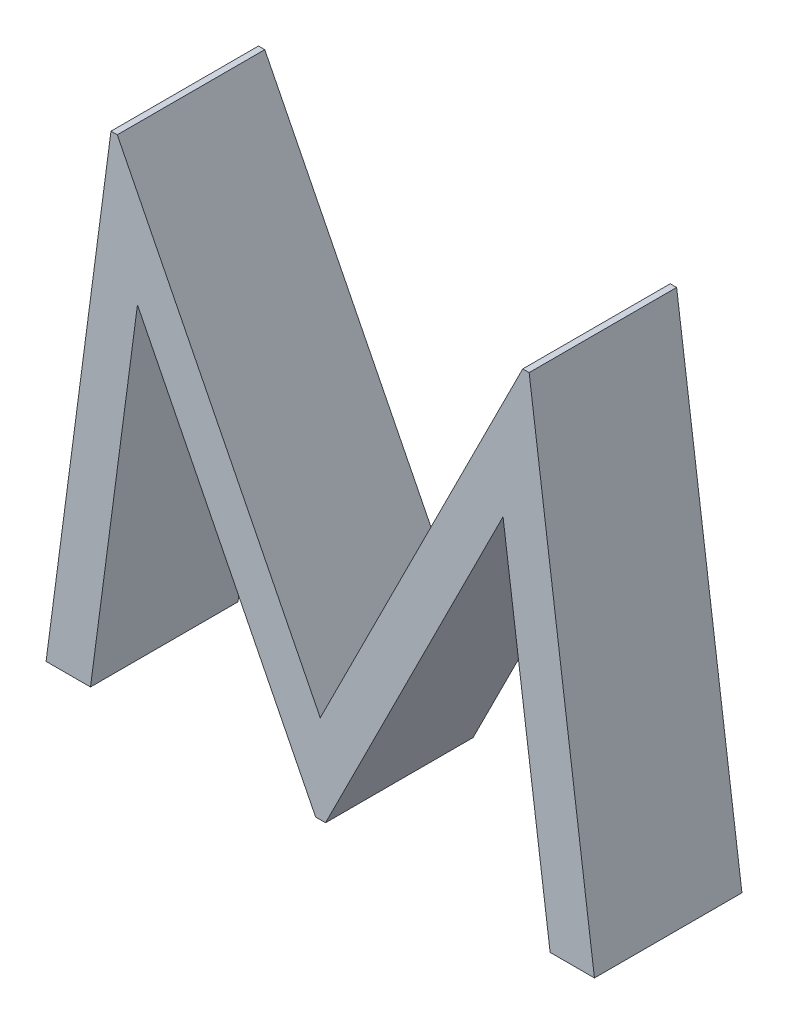
ISO-10303-21;
HEADER;
FILE_DESCRIPTION(('STEP AP214'),'2;1');
FILE_NAME('part.step','',(''),(''),'','','');
FILE_SCHEMA(('AUTOMOTIVE_DESIGN { 1 0 10303 214 1 1 1 1 }'));
ENDSEC;
DATA;
#1=APPLICATION_CONTEXT('core data for automotive mechanical design processes');
#2=APPLICATION_PROTOCOL_DEFINITION('international standard','automotive_design',2000,#1);
#3=PRODUCT_CONTEXT('',#1,'mechanical');
#4=PRODUCT('Part','Part','',(#3));
#5=PRODUCT_RELATED_PRODUCT_CATEGORY('part','',(#4));
#6=PRODUCT_DEFINITION_FORMATION('','',#4);
#7=PRODUCT_DEFINITION_CONTEXT('part definition',#1,'design');
#8=PRODUCT_DEFINITION('design','',#6,#7);
#9=PRODUCT_DEFINITION_SHAPE('','',#8);
#10=(LENGTH_UNIT() NAMED_UNIT(*) SI_UNIT(.MILLI.,.METRE.));
#11=(NAMED_UNIT(*) PLANE_ANGLE_UNIT() SI_UNIT($,.RADIAN.));
#12=(NAMED_UNIT(*) SI_UNIT($,.STERADIAN.) SOLID_ANGLE_UNIT());
#13=UNCERTAINTY_MEASURE_WITH_UNIT(LENGTH_MEASURE(1.E-05),#10,'distance_accuracy_value','');
#14=(GEOMETRIC_REPRESENTATION_CONTEXT(3) GLOBAL_UNCERTAINTY_ASSIGNED_CONTEXT((#13)) GLOBAL_UNIT_ASSIGNED_CONTEXT((#10,
#11,#12)) REPRESENTATION_CONTEXT('',''));
#15=CARTESIAN_POINT('',(0.,0.,0.));
#16=DIRECTION('',(0.,0.,1.));
#17=DIRECTION('',(1.,0.,0.));
#18=AXIS2_PLACEMENT_3D('',#15,#16,#17);
#19=CARTESIAN_POINT('',(-55.2371528258695,-22.8701190762308,1.5));
#20=DIRECTION('',(0.,-1.,0.));
#21=DIRECTION('',(0.,0.,-1.));
#22=AXIS2_PLACEMENT_3D('',#19,#20,#21);
#23=PLANE('',#22);
#24=DIRECTION('',(-1.,0.,0.));
#25=VECTOR('',#24,1.);
#26=CARTESIAN_POINT('',(-55.2371528258695,-22.8701190762308,0.));
#27=LINE('',#26,#25);
#28=CARTESIAN_POINT('',(-55.2371528258695,-22.8701190762308,0.));
#29=VERTEX_POINT('',#28);
#30=CARTESIAN_POINT('',(-55.6888755822798,-22.8701190762308,0.));
#31=VERTEX_POINT('',#30);
#32=EDGE_CURVE('E160',#29,#31,#27,.T.);
#33=ORIENTED_EDGE('',*,*,#32,.F.);
#34=DIRECTION('',(0.,0.,-1.));
#35=VECTOR('',#34,1.);
#36=CARTESIAN_POINT('',(-55.2371528258695,-22.8701190762308,1.5));
#37=LINE('',#36,#35);
#38=CARTESIAN_POINT('',(-55.2371528258695,-22.8701190762308,1.5));
#39=VERTEX_POINT('',#38);
#40=EDGE_CURVE('E11',#39,#29,#37,.T.);
#41=ORIENTED_EDGE('',*,*,#40,.F.);
#42=DIRECTION('',(-1.,0.,0.));
#43=VECTOR('',#42,1.);
#44=CARTESIAN_POINT('',(-55.2371528258695,-22.8701190762308,1.5));
#45=LINE('',#44,#43);
#46=CARTESIAN_POINT('',(-55.6888755822798,-22.8701190762308,1.5));
#47=VERTEX_POINT('',#46);
#48=EDGE_CURVE('E195',#39,#47,#45,.T.);
#49=ORIENTED_EDGE('',*,*,#48,.T.);
#50=DIRECTION('',(0.,0.,-1.));
#51=VECTOR('',#50,1.);
#52=CARTESIAN_POINT('',(-55.6888755822798,-22.8701190762308,1.5));
#53=LINE('',#52,#51);
#54=EDGE_CURVE('E36',#47,#31,#53,.T.);
#55=ORIENTED_EDGE('',*,*,#54,.T.);
#56=EDGE_LOOP('',(#33,#41,#49,#55));
#57=FACE_BOUND('',#56,.T.);
#58=ADVANCED_FACE('F33',(#57),#23,.T.);
#59=CARTESIAN_POINT('',(-54.7593884027926,-19.2643498454616,1.5));
#60=DIRECTION('',(0.991335792784035,-0.131351992543884,0.));
#61=DIRECTION('',(0.131351992543884,0.991335792784035,0.));
#62=AXIS2_PLACEMENT_3D('',#59,#60,#61);
#63=PLANE('',#62);
#64=DIRECTION('',(-0.131351992543884,-0.991335792784035,0.));
#65=VECTOR('',#64,1.);
#66=CARTESIAN_POINT('',(-54.7593884027926,-19.2643498454616,0.));
#67=LINE('',#66,#65);
#68=CARTESIAN_POINT('',(-54.7593884027926,-19.2643498454616,0.));
#69=VERTEX_POINT('',#68);
#70=EDGE_CURVE('E193',#69,#29,#67,.T.);
#71=ORIENTED_EDGE('',*,*,#70,.F.);
#72=DIRECTION('',(0.,0.,-1.));
#73=VECTOR('',#72,1.);
#74=CARTESIAN_POINT('',(-54.7593884027926,-19.2643498454616,1.5));
#75=LINE('',#74,#73);
#76=CARTESIAN_POINT('',(-54.7593884027926,-19.2643498454616,1.5));
#77=VERTEX_POINT('',#76);
#78=EDGE_CURVE('E42',#77,#69,#75,.T.);
#79=ORIENTED_EDGE('',*,*,#78,.F.);
#80=DIRECTION('',(-0.131351992543884,-0.991335792784035,0.));
#81=VECTOR('',#80,1.);
#82=CARTESIAN_POINT('',(-54.7593884027926,-19.2643498454616,1.5));
#83=LINE('',#82,#81);
#84=EDGE_CURVE('E150',#77,#39,#83,.T.);
#85=ORIENTED_EDGE('',*,*,#84,.T.);
#86=ORIENTED_EDGE('',*,*,#40,.T.);
#87=EDGE_LOOP('',(#71,#79,#85,#86));
#88=FACE_BOUND('',#87,.T.);
#89=ADVANCED_FACE('F217',(#88),#63,.T.);
#90=CARTESIAN_POINT('',(-52.9474893643311,-22.8701190762308,1.5));
#91=DIRECTION('',(-0.893531873849379,-0.448999766609313,0.));
#92=DIRECTION('',(0.448999766609313,-0.893531873849379,0.));
#93=AXIS2_PLACEMENT_3D('',#90,#91,#92);
#94=PLANE('',#93);
#95=DIRECTION('',(-0.448999766609313,0.893531873849379,0.));
#96=VECTOR('',#95,1.);
#97=CARTESIAN_POINT('',(-52.9474893643311,-22.8701190762308,0.));
#98=LINE('',#97,#96);
#99=CARTESIAN_POINT('',(-52.9474893643311,-22.8701190762308,0.));
#100=VERTEX_POINT('',#99);
#101=EDGE_CURVE('E137',#100,#69,#98,.T.);
#102=ORIENTED_EDGE('',*,*,#101,.F.);
#103=DIRECTION('',(0.,0.,-1.));
#104=VECTOR('',#103,1.);
#105=CARTESIAN_POINT('',(-52.9474893643311,-22.8701190762308,1.5));
#106=LINE('',#105,#104);
#107=CARTESIAN_POINT('',(-52.9474893643311,-22.8701190762308,1.5));
#108=VERTEX_POINT('',#107);
#109=EDGE_CURVE('E132',#108,#100,#106,.T.);
#110=ORIENTED_EDGE('',*,*,#109,.F.);
#111=DIRECTION('',(-0.448999766609313,0.893531873849379,0.));
#112=VECTOR('',#111,1.);
#113=CARTESIAN_POINT('',(-52.9474893643311,-22.8701190762308,1.5));
#114=LINE('',#113,#112);
#115=EDGE_CURVE('E135',#108,#77,#114,.T.);
#116=ORIENTED_EDGE('',*,*,#115,.T.);
#117=ORIENTED_EDGE('',*,*,#78,.T.);
#118=EDGE_LOOP('',(#102,#110,#116,#117));
#119=FACE_BOUND('',#118,.T.);
#120=ADVANCED_FACE('F134',(#119),#94,.T.);
#121=CARTESIAN_POINT('',(-52.8463275053567,-22.8701190762308,1.5));
#122=DIRECTION('',(0.,-1.,0.));
#123=DIRECTION('',(0.,0.,-1.));
#124=AXIS2_PLACEMENT_3D('',#121,#122,#123);
#125=PLANE('',#124);
#126=DIRECTION('',(-1.,0.,0.));
#127=VECTOR('',#126,1.);
#128=CARTESIAN_POINT('',(-52.8463275053567,-22.8701190762308,0.));
#129=LINE('',#128,#127);
#130=CARTESIAN_POINT('',(-52.8463275053567,-22.8701190762308,0.));
#131=VERTEX_POINT('',#130);
#132=EDGE_CURVE('E190',#131,#100,#129,.T.);
#133=ORIENTED_EDGE('',*,*,#132,.F.);
#134=DIRECTION('',(0.,0.,-1.));
#135=VECTOR('',#134,1.);
#136=CARTESIAN_POINT('',(-52.8463275053567,-22.8701190762308,1.5));
#137=LINE('',#136,#135);
#138=CARTESIAN_POINT('',(-52.8463275053567,-22.8701190762308,1.5));
#139=VERTEX_POINT('',#138);
#140=EDGE_CURVE('E142',#139,#131,#137,.T.);
#141=ORIENTED_EDGE('',*,*,#140,.F.);
#142=DIRECTION('',(-1.,0.,0.));
#143=VECTOR('',#142,1.);
#144=CARTESIAN_POINT('',(-52.8463275053567,-22.8701190762308,1.5));
#145=LINE('',#144,#143);
#146=EDGE_CURVE('E148',#139,#108,#145,.T.);
#147=ORIENTED_EDGE('',*,*,#146,.T.);
#148=ORIENTED_EDGE('',*,*,#109,.T.);
#149=EDGE_LOOP('',(#133,#141,#147,#148));
#150=FACE_BOUND('',#149,.T.);
#151=ADVANCED_FACE('F152',(#150),#125,.T.);
#152=CARTESIAN_POINT('',(-51.0414396848439,-19.2723626659744,1.5));
#153=DIRECTION('',(0.893829180214607,-0.44840762325911,0.));
#154=DIRECTION('',(0.44840762325911,0.893829180214607,0.));
#155=AXIS2_PLACEMENT_3D('',#152,#153,#154);
#156=PLANE('',#155);
#157=DIRECTION('',(-0.44840762325911,-0.893829180214607,0.));
#158=VECTOR('',#157,1.);
#159=CARTESIAN_POINT('',(-51.0414396848439,-19.2723626659744,0.));
#160=LINE('',#159,#158);
#161=CARTESIAN_POINT('',(-51.0414396848439,-19.2723626659744,0.));
#162=VERTEX_POINT('',#161);
#163=EDGE_CURVE('E187',#162,#131,#160,.T.);
#164=ORIENTED_EDGE('',*,*,#163,.F.);
#165=DIRECTION('',(0.,0.,-1.));
#166=VECTOR('',#165,1.);
#167=CARTESIAN_POINT('',(-51.0414396848439,-19.2723626659744,1.5));
#168=LINE('',#167,#166);
#169=CARTESIAN_POINT('',(-51.0414396848439,-19.2723626659744,1.5));
#170=VERTEX_POINT('',#169);
#171=EDGE_CURVE('E199',#170,#162,#168,.T.);
#172=ORIENTED_EDGE('',*,*,#171,.F.);
#173=DIRECTION('',(-0.44840762325911,-0.893829180214607,0.));
#174=VECTOR('',#173,1.);
#175=CARTESIAN_POINT('',(-51.0414396848439,-19.2723626659744,1.5));
#176=LINE('',#175,#174);
#177=EDGE_CURVE('E153',#170,#139,#176,.T.);
#178=ORIENTED_EDGE('',*,*,#177,.T.);
#179=ORIENTED_EDGE('',*,*,#140,.T.);
#180=EDGE_LOOP('',(#164,#172,#178,#179));
#181=FACE_BOUND('',#180,.T.);
#182=ADVANCED_FACE('F230',(#181),#156,.T.);
#183=CARTESIAN_POINT('',(-50.5626736592029,-22.8701190762308,1.5));
#184=DIRECTION('',(-0.991261610664233,-0.131910648635164,0.));
#185=DIRECTION('',(0.131910648635164,-0.991261610664234,0.));
#186=AXIS2_PLACEMENT_3D('',#183,#184,#185);
#187=PLANE('',#186);
#188=DIRECTION('',(-0.131910648635164,0.991261610664233,0.));
#189=VECTOR('',#188,1.);
#190=CARTESIAN_POINT('',(-50.5626736592029,-22.8701190762308,0.));
#191=LINE('',#190,#189);
#192=CARTESIAN_POINT('',(-50.5626736592029,-22.8701190762308,0.));
#193=VERTEX_POINT('',#192);
#194=EDGE_CURVE('E184',#193,#162,#191,.T.);
#195=ORIENTED_EDGE('',*,*,#194,.F.);
#196=DIRECTION('',(0.,0.,-1.));
#197=VECTOR('',#196,1.);
#198=CARTESIAN_POINT('',(-50.5626736592029,-22.8701190762308,1.5));
#199=LINE('',#198,#197);
#200=CARTESIAN_POINT('',(-50.5626736592029,-22.8701190762308,1.5));
#201=VERTEX_POINT('',#200);
#202=EDGE_CURVE('E201',#201,#193,#199,.T.);
#203=ORIENTED_EDGE('',*,*,#202,.F.);
#204=DIRECTION('',(-0.131910648635164,0.991261610664233,0.));
#205=VECTOR('',#204,1.);
#206=CARTESIAN_POINT('',(-50.5626736592029,-22.8701190762308,1.5));
#207=LINE('',#206,#205);
#208=EDGE_CURVE('E155',#201,#170,#207,.T.);
#209=ORIENTED_EDGE('',*,*,#208,.T.);
#210=ORIENTED_EDGE('',*,*,#171,.T.);
#211=EDGE_LOOP('',(#195,#203,#209,#210));
#212=FACE_BOUND('',#211,.T.);
#213=ADVANCED_FACE('F233',(#212),#187,.T.);
#214=CARTESIAN_POINT('',(-50.1119525053567,-22.8701190762308,1.5));
#215=DIRECTION('',(0.,-1.,0.));
#216=DIRECTION('',(0.,0.,-1.));
#217=AXIS2_PLACEMENT_3D('',#214,#215,#216);
#218=PLANE('',#217);
#219=DIRECTION('',(-1.,0.,0.));
#220=VECTOR('',#219,1.);
#221=CARTESIAN_POINT('',(-50.1119525053567,-22.8701190762308,0.));
#222=LINE('',#221,#220);
#223=CARTESIAN_POINT('',(-50.1119525053567,-22.8701190762308,0.));
#224=VERTEX_POINT('',#223);
#225=EDGE_CURVE('E181',#224,#193,#222,.T.);
#226=ORIENTED_EDGE('',*,*,#225,.F.);
#227=DIRECTION('',(0.,0.,-1.));
#228=VECTOR('',#227,1.);
#229=CARTESIAN_POINT('',(-50.1119525053567,-22.8701190762308,1.5));
#230=LINE('',#229,#228);
#231=CARTESIAN_POINT('',(-50.1119525053567,-22.8701190762308,1.5));
#232=VERTEX_POINT('',#231);
#233=EDGE_CURVE('E203',#232,#224,#230,.T.);
#234=ORIENTED_EDGE('',*,*,#233,.F.);
#235=DIRECTION('',(-1.,0.,0.));
#236=VECTOR('',#235,1.);
#237=CARTESIAN_POINT('',(-50.1119525053567,-22.8701190762308,1.5));
#238=LINE('',#237,#236);
#239=EDGE_CURVE('E391',#232,#201,#238,.T.);
#240=ORIENTED_EDGE('',*,*,#239,.T.);
#241=ORIENTED_EDGE('',*,*,#202,.T.);
#242=EDGE_LOOP('',(#226,#234,#240,#241));
#243=FACE_BOUND('',#242,.T.);
#244=ADVANCED_FACE('F237',(#243),#218,.T.);
#245=CARTESIAN_POINT('',(-50.7760150053567,-17.8701190762308,1.5));
#246=DIRECTION('',(0.991295408390988,0.131656421426928,0.));
#247=DIRECTION('',(-0.131656421426928,0.991295408390988,0.));
#248=AXIS2_PLACEMENT_3D('',#245,#246,#247);
#249=PLANE('',#248);
#250=DIRECTION('',(0.131656421426928,-0.991295408390988,0.));
#251=VECTOR('',#250,1.);
#252=CARTESIAN_POINT('',(-50.7760150053567,-17.8701190762308,0.));
#253=LINE('',#252,#251);
#254=CARTESIAN_POINT('',(-50.7760150053567,-17.8701190762308,0.));
#255=VERTEX_POINT('',#254);
#256=EDGE_CURVE('E178',#255,#224,#253,.T.);
#257=ORIENTED_EDGE('',*,*,#256,.F.);
#258=DIRECTION('',(0.,0.,-1.));
#259=VECTOR('',#258,1.);
#260=CARTESIAN_POINT('',(-50.7760150053567,-17.8701190762308,1.5));
#261=LINE('',#260,#259);
#262=CARTESIAN_POINT('',(-50.7760150053567,-17.8701190762308,1.5));
#263=VERTEX_POINT('',#262);
#264=EDGE_CURVE('E205',#263,#255,#261,.T.);
#265=ORIENTED_EDGE('',*,*,#264,.F.);
#266=DIRECTION('',(0.131656421426928,-0.991295408390988,0.));
#267=VECTOR('',#266,1.);
#268=CARTESIAN_POINT('',(-50.7760150053567,-17.8701190762308,1.5));
#269=LINE('',#268,#267);
#270=EDGE_CURVE('E387',#263,#232,#269,.T.);
#271=ORIENTED_EDGE('',*,*,#270,.T.);
#272=ORIENTED_EDGE('',*,*,#233,.T.);
#273=EDGE_LOOP('',(#257,#265,#271,#272));
#274=FACE_BOUND('',#273,.T.);
#275=ADVANCED_FACE('F241',(#274),#249,.T.);
#276=CARTESIAN_POINT('',(-50.8411191720234,-17.8701190762308,1.5));
#277=DIRECTION('',(0.,1.,0.));
#278=DIRECTION('',(0.,0.,1.));
#279=AXIS2_PLACEMENT_3D('',#276,#277,#278);
#280=PLANE('',#279);
#281=DIRECTION('',(1.,0.,0.));
#282=VECTOR('',#281,1.);
#283=CARTESIAN_POINT('',(-50.8411191720234,-17.8701190762308,0.));
#284=LINE('',#283,#282);
#285=CARTESIAN_POINT('',(-50.8411191720234,-17.8701190762308,0.));
#286=VERTEX_POINT('',#285);
#287=EDGE_CURVE('E175',#286,#255,#284,.T.);
#288=ORIENTED_EDGE('',*,*,#287,.F.);
#289=DIRECTION('',(0.,0.,-1.));
#290=VECTOR('',#289,1.);
#291=CARTESIAN_POINT('',(-50.8411191720234,-17.8701190762308,1.5));
#292=LINE('',#291,#290);
#293=CARTESIAN_POINT('',(-50.8411191720234,-17.8701190762308,1.5));
#294=VERTEX_POINT('',#293);
#295=EDGE_CURVE('E207',#294,#286,#292,.T.);
#296=ORIENTED_EDGE('',*,*,#295,.F.);
#297=DIRECTION('',(1.,0.,0.));
#298=VECTOR('',#297,1.);
#299=CARTESIAN_POINT('',(-50.8411191720234,-17.8701190762308,1.5));
#300=LINE('',#299,#298);
#301=EDGE_CURVE('E398',#294,#263,#300,.T.);
#302=ORIENTED_EDGE('',*,*,#301,.T.);
#303=ORIENTED_EDGE('',*,*,#264,.T.);
#304=EDGE_LOOP('',(#288,#296,#302,#303));
#305=FACE_BOUND('',#304,.T.);
#306=ADVANCED_FACE('F245',(#305),#280,.T.);
#307=CARTESIAN_POINT('',(-52.9004140438183,-21.9726831787949,1.5));
#308=DIRECTION('',(-0.893727875972726,0.448609500244121,0.));
#309=DIRECTION('',(-0.448609500244121,-0.893727875972726,0.));
#310=AXIS2_PLACEMENT_3D('',#307,#308,#309);
#311=PLANE('',#310);
#312=DIRECTION('',(0.448609500244121,0.893727875972726,0.));
#313=VECTOR('',#312,1.);
#314=CARTESIAN_POINT('',(-52.9004140438183,-21.9726831787949,0.));
#315=LINE('',#314,#313);
#316=CARTESIAN_POINT('',(-52.9004140438183,-21.9726831787949,0.));
#317=VERTEX_POINT('',#316);
#318=EDGE_CURVE('E172',#317,#286,#315,.T.);
#319=ORIENTED_EDGE('',*,*,#318,.F.);
#320=DIRECTION('',(0.,0.,-1.));
#321=VECTOR('',#320,1.);
#322=CARTESIAN_POINT('',(-52.9004140438183,-21.9726831787949,1.5));
#323=LINE('',#322,#321);
#324=CARTESIAN_POINT('',(-52.9004140438183,-21.9726831787949,1.5));
#325=VERTEX_POINT('',#324);
#326=EDGE_CURVE('E209',#325,#317,#323,.T.);
#327=ORIENTED_EDGE('',*,*,#326,.F.);
#328=DIRECTION('',(0.448609500244121,0.893727875972726,0.));
#329=VECTOR('',#328,1.);
#330=CARTESIAN_POINT('',(-52.9004140438183,-21.9726831787949,1.5));
#331=LINE('',#330,#329);
#332=EDGE_CURVE('E380',#325,#294,#331,.T.);
#333=ORIENTED_EDGE('',*,*,#332,.T.);
#334=ORIENTED_EDGE('',*,*,#295,.T.);
#335=EDGE_LOOP('',(#319,#327,#333,#334));
#336=FACE_BOUND('',#335,.T.);
#337=ADVANCED_FACE('F249',(#336),#311,.T.);
#338=CARTESIAN_POINT('',(-54.9647169284336,-17.8701190762308,1.5));
#339=DIRECTION('',(0.893290255312065,0.44948027739213,0.));
#340=DIRECTION('',(-0.44948027739213,0.893290255312065,0.));
#341=AXIS2_PLACEMENT_3D('',#338,#339,#340);
#342=PLANE('',#341);
#343=DIRECTION('',(0.44948027739213,-0.893290255312065,0.));
#344=VECTOR('',#343,1.);
#345=CARTESIAN_POINT('',(-54.9647169284336,-17.8701190762308,0.));
#346=LINE('',#345,#344);
#347=CARTESIAN_POINT('',(-54.9647169284336,-17.8701190762308,0.));
#348=VERTEX_POINT('',#347);
#349=EDGE_CURVE('E169',#348,#317,#346,.T.);
#350=ORIENTED_EDGE('',*,*,#349,.F.);
#351=DIRECTION('',(0.,0.,-1.));
#352=VECTOR('',#351,1.);
#353=CARTESIAN_POINT('',(-54.9647169284336,-17.8701190762308,1.5));
#354=LINE('',#353,#352);
#355=CARTESIAN_POINT('',(-54.9647169284336,-17.8701190762308,1.5));
#356=VERTEX_POINT('',#355);
#357=EDGE_CURVE('E211',#356,#348,#354,.T.);
#358=ORIENTED_EDGE('',*,*,#357,.F.);
#359=DIRECTION('',(0.44948027739213,-0.893290255312065,0.));
#360=VECTOR('',#359,1.);
#361=CARTESIAN_POINT('',(-54.9647169284336,-17.8701190762308,1.5));
#362=LINE('',#361,#360);
#363=EDGE_CURVE('E376',#356,#325,#362,.T.);
#364=ORIENTED_EDGE('',*,*,#363,.T.);
#365=ORIENTED_EDGE('',*,*,#326,.T.);
#366=EDGE_LOOP('',(#350,#358,#364,#365));
#367=FACE_BOUND('',#366,.T.);
#368=ADVANCED_FACE('F253',(#367),#342,.T.);
#369=CARTESIAN_POINT('',(-55.0288194925362,-17.8701190762308,1.5));
#370=DIRECTION('',(0.,1.,0.));
#371=DIRECTION('',(0.,0.,1.));
#372=AXIS2_PLACEMENT_3D('',#369,#370,#371);
#373=PLANE('',#372);
#374=DIRECTION('',(1.,0.,0.));
#375=VECTOR('',#374,1.);
#376=CARTESIAN_POINT('',(-55.0288194925362,-17.8701190762308,0.));
#377=LINE('',#376,#375);
#378=CARTESIAN_POINT('',(-55.0288194925362,-17.8701190762308,0.));
#379=VERTEX_POINT('',#378);
#380=EDGE_CURVE('E166',#379,#348,#377,.T.);
#381=ORIENTED_EDGE('',*,*,#380,.F.);
#382=DIRECTION('',(0.,0.,-1.));
#383=VECTOR('',#382,1.);
#384=CARTESIAN_POINT('',(-55.0288194925362,-17.8701190762308,1.5));
#385=LINE('',#384,#383);
#386=CARTESIAN_POINT('',(-55.0288194925362,-17.8701190762308,1.5));
#387=VERTEX_POINT('',#386);
#388=EDGE_CURVE('E212',#387,#379,#385,.T.);
#389=ORIENTED_EDGE('',*,*,#388,.F.);
#390=DIRECTION('',(1.,0.,0.));
#391=VECTOR('',#390,1.);
#392=CARTESIAN_POINT('',(-55.0288194925362,-17.8701190762308,1.5));
#393=LINE('',#392,#391);
#394=EDGE_CURVE('E402',#387,#356,#393,.T.);
#395=ORIENTED_EDGE('',*,*,#394,.T.);
#396=ORIENTED_EDGE('',*,*,#357,.T.);
#397=EDGE_LOOP('',(#381,#389,#395,#396));
#398=FACE_BOUND('',#397,.T.);
#399=ADVANCED_FACE('F257',(#398),#373,.T.);
#400=CARTESIAN_POINT('',(-55.6888755822798,-22.8701190762308,1.5));
#401=DIRECTION('',(-0.991398777198715,0.130875760050871,0.));
#402=DIRECTION('',(-0.130875760050871,-0.991398777198715,0.));
#403=AXIS2_PLACEMENT_3D('',#400,#401,#402);
#404=PLANE('',#403);
#405=DIRECTION('',(0.130875760050871,0.991398777198715,0.));
#406=VECTOR('',#405,1.);
#407=CARTESIAN_POINT('',(-55.6888755822798,-22.8701190762308,0.));
#408=LINE('',#407,#406);
#409=EDGE_CURVE('E163',#31,#379,#408,.T.);
#410=ORIENTED_EDGE('',*,*,#409,.F.);
#411=ORIENTED_EDGE('',*,*,#54,.F.);
#412=DIRECTION('',(0.130875760050871,0.991398777198715,0.));
#413=VECTOR('',#412,1.);
#414=CARTESIAN_POINT('',(-55.6888755822798,-22.8701190762308,1.5));
#415=LINE('',#414,#413);
#416=EDGE_CURVE('E404',#47,#387,#415,.T.);
#417=ORIENTED_EDGE('',*,*,#416,.T.);
#418=ORIENTED_EDGE('',*,*,#388,.T.);
#419=EDGE_LOOP('',(#410,#411,#417,#418));
#420=FACE_BOUND('',#419,.T.);
#421=ADVANCED_FACE('F214',(#420),#404,.T.);
#422=CARTESIAN_POINT('',(0.,0.,1.5));
#423=DIRECTION('',(0.,0.,-1.));
#424=DIRECTION('',(-1.,0.,0.));
#425=AXIS2_PLACEMENT_3D('',#422,#423,#424);
#426=PLANE('',#425);
#427=ORIENTED_EDGE('',*,*,#48,.F.);
#428=ORIENTED_EDGE('',*,*,#84,.F.);
#429=ORIENTED_EDGE('',*,*,#115,.F.);
#430=ORIENTED_EDGE('',*,*,#146,.F.);
#431=ORIENTED_EDGE('',*,*,#177,.F.);
#432=ORIENTED_EDGE('',*,*,#208,.F.);
#433=ORIENTED_EDGE('',*,*,#239,.F.);
#434=ORIENTED_EDGE('',*,*,#270,.F.);
#435=ORIENTED_EDGE('',*,*,#301,.F.);
#436=ORIENTED_EDGE('',*,*,#332,.F.);
#437=ORIENTED_EDGE('',*,*,#363,.F.);
#438=ORIENTED_EDGE('',*,*,#394,.F.);
#439=ORIENTED_EDGE('',*,*,#416,.F.);
#440=EDGE_LOOP('',(#427,#428,#429,#430,#431,#432,#433,#434,#435,#436,#437,#438,#439));
#441=FACE_BOUND('',#440,.T.);
#442=ADVANCED_FACE('F146',(#441),#426,.F.);
#443=CARTESIAN_POINT('',(0.,0.,0.));
#444=DIRECTION('',(0.,0.,-1.));
#445=DIRECTION('',(-1.,0.,0.));
#446=AXIS2_PLACEMENT_3D('',#443,#444,#445);
#447=PLANE('',#446);
#448=ORIENTED_EDGE('',*,*,#32,.T.);
#449=ORIENTED_EDGE('',*,*,#409,.T.);
#450=ORIENTED_EDGE('',*,*,#380,.T.);
#451=ORIENTED_EDGE('',*,*,#349,.T.);
#452=ORIENTED_EDGE('',*,*,#318,.T.);
#453=ORIENTED_EDGE('',*,*,#287,.T.);
#454=ORIENTED_EDGE('',*,*,#256,.T.);
#455=ORIENTED_EDGE('',*,*,#225,.T.);
#456=ORIENTED_EDGE('',*,*,#194,.T.);
#457=ORIENTED_EDGE('',*,*,#163,.T.);
#458=ORIENTED_EDGE('',*,*,#132,.T.);
#459=ORIENTED_EDGE('',*,*,#101,.T.);
#460=ORIENTED_EDGE('',*,*,#70,.T.);
#461=EDGE_LOOP('',(#448,#449,#450,#451,#452,#453,#454,#455,#456,#457,#458,#459,#460));
#462=FACE_BOUND('',#461,.T.);
#463=ADVANCED_FACE('F216',(#462),#447,.T.);
#464=CLOSED_SHELL('',(#58,#89,#120,#151,#182,#213,#244,#275,#306,#337,#368,#399,#421,#442,#463));
#465=MANIFOLD_SOLID_BREP('B2',#464);
#466=ADVANCED_BREP_SHAPE_REPRESENTATION('',(#18,#465),#14);
#467=SHAPE_DEFINITION_REPRESENTATION(#9,#466);
ENDSEC;
END-ISO-10303-21;
